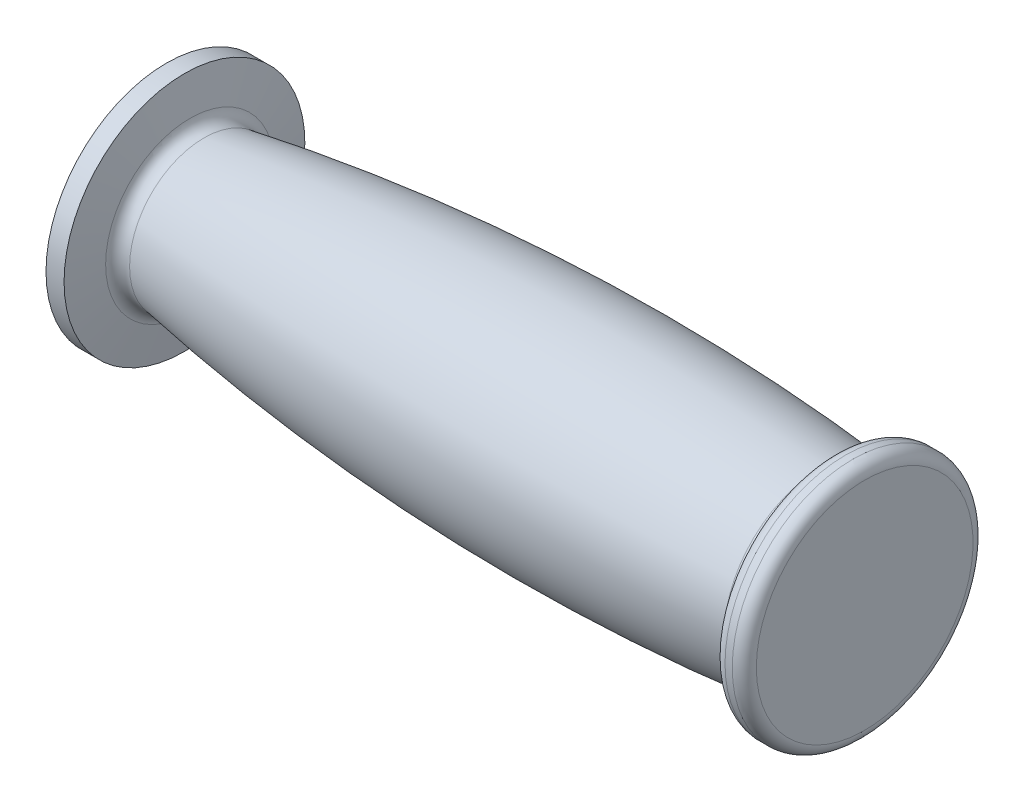
ISO-10303-21;
HEADER;
FILE_DESCRIPTION(('STEP AP214'),'2;1');
FILE_NAME('part.step','',(''),(''),'','','');
FILE_SCHEMA(('AUTOMOTIVE_DESIGN { 1 0 10303 214 1 1 1 1 }'));
ENDSEC;
DATA;
#1=APPLICATION_CONTEXT('core data for automotive mechanical design processes');
#2=APPLICATION_PROTOCOL_DEFINITION('international standard','automotive_design',2000,#1);
#3=PRODUCT_CONTEXT('',#1,'mechanical');
#4=PRODUCT('Part','Part','',(#3));
#5=PRODUCT_RELATED_PRODUCT_CATEGORY('part','',(#4));
#6=PRODUCT_DEFINITION_FORMATION('','',#4);
#7=PRODUCT_DEFINITION_CONTEXT('part definition',#1,'design');
#8=PRODUCT_DEFINITION('design','',#6,#7);
#9=PRODUCT_DEFINITION_SHAPE('','',#8);
#10=(LENGTH_UNIT() NAMED_UNIT(*) SI_UNIT(.MILLI.,.METRE.));
#11=(NAMED_UNIT(*) PLANE_ANGLE_UNIT() SI_UNIT($,.RADIAN.));
#12=(NAMED_UNIT(*) SI_UNIT($,.STERADIAN.) SOLID_ANGLE_UNIT());
#13=UNCERTAINTY_MEASURE_WITH_UNIT(LENGTH_MEASURE(1.E-05),#10,'distance_accuracy_value','');
#14=(GEOMETRIC_REPRESENTATION_CONTEXT(3) GLOBAL_UNCERTAINTY_ASSIGNED_CONTEXT((#13)) GLOBAL_UNIT_ASSIGNED_CONTEXT((#10,
#11,#12)) REPRESENTATION_CONTEXT('',''));
#15=CARTESIAN_POINT('',(0.,0.,0.));
#16=DIRECTION('',(0.,0.,1.));
#17=DIRECTION('',(1.,0.,0.));
#18=AXIS2_PLACEMENT_3D('',#15,#16,#17);
#19=CARTESIAN_POINT('',(0.,0.,0.));
#20=DIRECTION('',(1.,0.,0.));
#21=DIRECTION('',(0.,0.,-1.));
#22=AXIS2_PLACEMENT_3D('',#19,#20,#21);
#23=PLANE('',#22);
#24=CARTESIAN_POINT('',(0.,0.,0.));
#25=DIRECTION('',(-1.,0.,0.));
#26=DIRECTION('',(0.,0.,1.));
#27=AXIS2_PLACEMENT_3D('',#24,#25,#26);
#28=CIRCLE('',#27,5.00000000000017);
#29=CARTESIAN_POINT('',(0.,0.,5.00000000000017));
#30=VERTEX_POINT('',#29);
#31=EDGE_CURVE('E65',#30,#30,#28,.T.);
#32=ORIENTED_EDGE('',*,*,#31,.T.);
#33=EDGE_LOOP('',(#32));
#34=FACE_BOUND('',#33,.T.);
#35=ADVANCED_FACE('F33',(#34),#23,.F.);
#36=CARTESIAN_POINT('',(0.,0.,0.));
#37=DIRECTION('',(-1.,0.,0.));
#38=DIRECTION('',(0.,0.,1.));
#39=AXIS2_PLACEMENT_3D('',#36,#37,#38);
#40=CYLINDRICAL_SURFACE('',#39,5.00000000000009);
#41=ORIENTED_EDGE('',*,*,#31,.F.);
#42=EDGE_LOOP('',(#41));
#43=FACE_BOUND('',#42,.T.);
#44=CARTESIAN_POINT('',(5.,0.,0.));
#45=DIRECTION('',(-1.,0.,0.));
#46=DIRECTION('',(0.,0.,1.));
#47=AXIS2_PLACEMENT_3D('',#44,#45,#46);
#48=CIRCLE('',#47,5.);
#49=CARTESIAN_POINT('',(5.,0.,5.));
#50=VERTEX_POINT('',#49);
#51=EDGE_CURVE('E68',#50,#50,#48,.T.);
#52=ORIENTED_EDGE('',*,*,#51,.T.);
#53=EDGE_LOOP('',(#52));
#54=FACE_BOUND('',#53,.T.);
#55=ADVANCED_FACE('F102',(#43,#54),#40,.T.);
#56=CARTESIAN_POINT('',(5.,5.,0.));
#57=DIRECTION('',(1.,0.,0.));
#58=DIRECTION('',(0.,0.,-1.));
#59=AXIS2_PLACEMENT_3D('',#56,#57,#58);
#60=PLANE('',#59);
#61=ORIENTED_EDGE('',*,*,#51,.F.);
#62=EDGE_LOOP('',(#61));
#63=FACE_BOUND('',#62,.T.);
#64=CARTESIAN_POINT('',(5.,0.,0.));
#65=DIRECTION('',(-1.,0.,0.));
#66=DIRECTION('',(0.,0.,1.));
#67=AXIS2_PLACEMENT_3D('',#64,#65,#66);
#68=CIRCLE('',#67,7.);
#69=CARTESIAN_POINT('',(5.,0.,7.));
#70=VERTEX_POINT('',#69);
#71=EDGE_CURVE('E71',#70,#70,#68,.T.);
#72=ORIENTED_EDGE('',*,*,#71,.T.);
#73=EDGE_LOOP('',(#72));
#74=FACE_BOUND('',#73,.T.);
#75=ADVANCED_FACE('F108',(#63,#74),#60,.F.);
#76=CARTESIAN_POINT('',(0.,0.,0.));
#77=DIRECTION('',(-1.,0.,0.));
#78=DIRECTION('',(0.,0.,1.));
#79=AXIS2_PLACEMENT_3D('',#76,#77,#78);
#80=CYLINDRICAL_SURFACE('',#79,7.);
#81=ORIENTED_EDGE('',*,*,#71,.F.);
#82=EDGE_LOOP('',(#81));
#83=FACE_BOUND('',#82,.T.);
#84=CARTESIAN_POINT('',(7.,0.,0.));
#85=DIRECTION('',(-1.,0.,0.));
#86=DIRECTION('',(0.,0.,1.));
#87=AXIS2_PLACEMENT_3D('',#84,#85,#86);
#88=CIRCLE('',#87,7.);
#89=CARTESIAN_POINT('',(7.,0.,7.));
#90=VERTEX_POINT('',#89);
#91=EDGE_CURVE('E74',#90,#90,#88,.T.);
#92=ORIENTED_EDGE('',*,*,#91,.T.);
#93=EDGE_LOOP('',(#92));
#94=FACE_BOUND('',#93,.T.);
#95=ADVANCED_FACE('F188',(#83,#94),#80,.T.);
#96=CARTESIAN_POINT('',(8.99999999999999,0.,0.));
#97=DIRECTION('',(1.,0.,0.));
#98=DIRECTION('',(0.,0.,-1.));
#99=AXIS2_PLACEMENT_3D('',#96,#97,#98);
#100=CONICAL_SURFACE('',#99,20.0000000000002,1.41814699839963);
#101=ORIENTED_EDGE('',*,*,#91,.F.);
#102=EDGE_LOOP('',(#101));
#103=FACE_BOUND('',#102,.T.);
#104=CARTESIAN_POINT('',(8.99999999999999,0.,0.));
#105=DIRECTION('',(-1.,0.,0.));
#106=DIRECTION('',(0.,0.,1.));
#107=AXIS2_PLACEMENT_3D('',#104,#105,#106);
#108=CIRCLE('',#107,20.0000000000002);
#109=CARTESIAN_POINT('',(8.99999999999999,0.,20.0000000000002));
#110=VERTEX_POINT('',#109);
#111=EDGE_CURVE('E77',#110,#110,#108,.T.);
#112=ORIENTED_EDGE('',*,*,#111,.T.);
#113=EDGE_LOOP('',(#112));
#114=FACE_BOUND('',#113,.T.);
#115=ADVANCED_FACE('F98',(#103,#114),#100,.T.);
#116=CARTESIAN_POINT('',(0.,0.,0.));
#117=DIRECTION('',(-1.,0.,0.));
#118=DIRECTION('',(0.,0.,1.));
#119=AXIS2_PLACEMENT_3D('',#116,#117,#118);
#120=CYLINDRICAL_SURFACE('',#119,20.0000000000002);
#121=ORIENTED_EDGE('',*,*,#111,.F.);
#122=EDGE_LOOP('',(#121));
#123=FACE_BOUND('',#122,.T.);
#124=CARTESIAN_POINT('',(12.,0.,0.));
#125=DIRECTION('',(-1.,0.,0.));
#126=DIRECTION('',(0.,0.,1.));
#127=AXIS2_PLACEMENT_3D('',#124,#125,#126);
#128=CIRCLE('',#127,20.0000000000002);
#129=CARTESIAN_POINT('',(12.,0.,20.0000000000002));
#130=VERTEX_POINT('',#129);
#131=EDGE_CURVE('E80',#130,#130,#128,.T.);
#132=ORIENTED_EDGE('',*,*,#131,.T.);
#133=EDGE_LOOP('',(#132));
#134=FACE_BOUND('',#133,.T.);
#135=ADVANCED_FACE('F84',(#123,#134),#120,.T.);
#136=CARTESIAN_POINT('',(13.2307692307693,0.,0.));
#137=DIRECTION('',(-1.,0.,0.));
#138=DIRECTION('',(0.,0.,1.));
#139=AXIS2_PLACEMENT_3D('',#136,#137,#138);
#140=CONICAL_SURFACE('',#139,12.,1.41814699839962);
#141=CARTESIAN_POINT('',(12.9207529298606,0.,0.));
#142=DIRECTION('',(-1.,0.,0.));
#143=DIRECTION('',(0.,0.,1.));
#144=AXIS2_PLACEMENT_3D('',#141,#142,#143);
#145=CIRCLE('',#144,14.0151059559066);
#146=CARTESIAN_POINT('',(12.9207529298606,0.,14.0151059559066));
#147=VERTEX_POINT('',#146);
#148=EDGE_CURVE('E62',#147,#147,#145,.T.);
#149=ORIENTED_EDGE('',*,*,#148,.T.);
#150=EDGE_LOOP('',(#149));
#151=FACE_BOUND('',#150,.T.);
#152=ORIENTED_EDGE('',*,*,#131,.F.);
#153=EDGE_LOOP('',(#152));
#154=FACE_BOUND('',#153,.T.);
#155=ADVANCED_FACE('F86',(#151,#154),#140,.T.);
#156=CARTESIAN_POINT('',(79.5987957119094,0.,0.));
#157=DIRECTION('',(-1.,0.,0.));
#158=DIRECTION('',(0.,0.,1.));
#159=AXIS2_PLACEMENT_3D('',#156,#157,#158);
#160=DEGENERATE_TOROIDAL_SURFACE('',#159,364.391781986394,382.198231924082,.F.);
#161=CARTESIAN_POINT('',(15.2343083873242,0.,0.));
#162=DIRECTION('',(1.,0.,0.));
#163=DIRECTION('',(0.,0.,-1.));
#164=AXIS2_PLACEMENT_3D('',#161,#162,#163);
#165=CIRCLE('',#164,12.3477848994559);
#166=CARTESIAN_POINT('',(15.2343083873242,0.,-12.3477848994559));
#167=VERTEX_POINT('',#166);
#168=EDGE_CURVE('E56',#167,#167,#165,.T.);
#169=ORIENTED_EDGE('',*,*,#168,.T.);
#170=EDGE_LOOP('',(#169));
#171=FACE_BOUND('',#170,.T.);
#172=CARTESIAN_POINT('',(117.570158716464,0.,0.));
#173=DIRECTION('',(-1.,0.,0.));
#174=DIRECTION('',(0.,0.,1.));
#175=AXIS2_PLACEMENT_3D('',#172,#173,#174);
#176=CIRCLE('',#175,15.9155464697781);
#177=CARTESIAN_POINT('',(117.570158716464,0.,15.9155464697781));
#178=VERTEX_POINT('',#177);
#179=EDGE_CURVE('E59',#178,#178,#176,.T.);
#180=ORIENTED_EDGE('',*,*,#179,.T.);
#181=EDGE_LOOP('',(#180));
#182=FACE_BOUND('',#181,.T.);
#183=ADVANCED_FACE('F88',(#171,#182),#160,.F.);
#184=CARTESIAN_POINT('',(120.,0.,0.));
#185=DIRECTION('',(1.,0.,0.));
#186=DIRECTION('',(0.,0.,-1.));
#187=AXIS2_PLACEMENT_3D('',#184,#185,#186);
#188=CONICAL_SURFACE('',#187,20.,1.46607657167523);
#189=CARTESIAN_POINT('',(119.811764297859,0.,0.));
#190=DIRECTION('',(-1.,0.,0.));
#191=DIRECTION('',(0.,0.,1.));
#192=AXIS2_PLACEMENT_3D('',#189,#190,#191);
#193=CIRCLE('',#192,18.2090569265353);
#194=CARTESIAN_POINT('',(119.811764297859,0.,18.2090569265353));
#195=VERTEX_POINT('',#194);
#196=EDGE_CURVE('E10',#195,#195,#193,.T.);
#197=ORIENTED_EDGE('',*,*,#196,.T.);
#198=EDGE_LOOP('',(#197));
#199=FACE_BOUND('',#198,.T.);
#200=CARTESIAN_POINT('',(119.757902343217,0.,0.));
#201=DIRECTION('',(1.,0.,0.));
#202=DIRECTION('',(0.,0.,-1.));
#203=AXIS2_PLACEMENT_3D('',#200,#201,#202);
#204=CIRCLE('',#203,17.6965946598552);
#205=CARTESIAN_POINT('',(119.757902343217,0.,-17.6965946598552));
#206=VERTEX_POINT('',#205);
#207=EDGE_CURVE('E40',#206,#206,#204,.T.);
#208=ORIENTED_EDGE('',*,*,#207,.T.);
#209=EDGE_LOOP('',(#208));
#210=FACE_BOUND('',#209,.T.);
#211=ADVANCED_FACE('F95',(#199,#210),#188,.T.);
#212=CARTESIAN_POINT('',(0.,0.,0.));
#213=DIRECTION('',(-1.,0.,0.));
#214=DIRECTION('',(0.,0.,1.));
#215=AXIS2_PLACEMENT_3D('',#212,#213,#214);
#216=CYLINDRICAL_SURFACE('',#215,20.);
#217=CARTESIAN_POINT('',(123.,0.,0.));
#218=DIRECTION('',(-1.,0.,0.));
#219=DIRECTION('',(0.,0.,1.));
#220=AXIS2_PLACEMENT_3D('',#217,#218,#219);
#221=CIRCLE('',#220,20.);
#222=CARTESIAN_POINT('',(123.,0.,20.));
#223=VERTEX_POINT('',#222);
#224=EDGE_CURVE('E48',#223,#223,#221,.T.);
#225=ORIENTED_EDGE('',*,*,#224,.T.);
#226=EDGE_LOOP('',(#225));
#227=FACE_BOUND('',#226,.T.);
#228=CARTESIAN_POINT('',(121.800808088596,0.,0.));
#229=DIRECTION('',(1.,0.,0.));
#230=DIRECTION('',(0.,0.,-1.));
#231=AXIS2_PLACEMENT_3D('',#228,#229,#230);
#232=CIRCLE('',#231,20.);
#233=CARTESIAN_POINT('',(121.800808088596,0.,-20.));
#234=VERTEX_POINT('',#233);
#235=EDGE_CURVE('E53',#234,#234,#232,.T.);
#236=ORIENTED_EDGE('',*,*,#235,.T.);
#237=EDGE_LOOP('',(#236));
#238=FACE_BOUND('',#237,.T.);
#239=ADVANCED_FACE('F131',(#227,#238),#216,.T.);
#240=CARTESIAN_POINT('',(125.,20.,0.));
#241=DIRECTION('',(-1.,0.,0.));
#242=DIRECTION('',(0.,0.,1.));
#243=AXIS2_PLACEMENT_3D('',#240,#241,#242);
#244=PLANE('',#243);
#245=CARTESIAN_POINT('',(125.,0.,0.));
#246=DIRECTION('',(-1.,0.,0.));
#247=DIRECTION('',(0.,0.,1.));
#248=AXIS2_PLACEMENT_3D('',#245,#246,#247);
#249=CIRCLE('',#248,18.);
#250=CARTESIAN_POINT('',(125.,0.,18.));
#251=VERTEX_POINT('',#250);
#252=EDGE_CURVE('E44',#251,#251,#249,.F.);
#253=ORIENTED_EDGE('',*,*,#252,.T.);
#254=EDGE_LOOP('',(#253));
#255=FACE_BOUND('',#254,.T.);
#256=ADVANCED_FACE('F117',(#255),#244,.F.);
#257=CARTESIAN_POINT('',(14.8974963251619,0.,0.));
#258=DIRECTION('',(-1.,0.,0.));
#259=DIRECTION('',(0.,0.,1.));
#260=AXIS2_PLACEMENT_3D('',#257,#258,#259);
#261=TOROIDAL_SURFACE('',#260,14.3192203244145,2.);
#262=ORIENTED_EDGE('',*,*,#168,.F.);
#263=EDGE_LOOP('',(#262));
#264=FACE_BOUND('',#263,.T.);
#265=ORIENTED_EDGE('',*,*,#148,.F.);
#266=EDGE_LOOP('',(#265));
#267=FACE_BOUND('',#266,.T.);
#268=ADVANCED_FACE('F113',(#264,#267),#261,.F.);
#269=CARTESIAN_POINT('',(123.,0.,0.));
#270=DIRECTION('',(-1.,0.,0.));
#271=DIRECTION('',(0.,0.,1.));
#272=AXIS2_PLACEMENT_3D('',#269,#270,#271);
#273=TOROIDAL_SURFACE('',#272,18.,2.);
#274=ORIENTED_EDGE('',*,*,#252,.F.);
#275=EDGE_LOOP('',(#274));
#276=FACE_BOUND('',#275,.T.);
#277=ORIENTED_EDGE('',*,*,#224,.F.);
#278=EDGE_LOOP('',(#277));
#279=FACE_BOUND('',#278,.T.);
#280=ADVANCED_FACE('F116',(#276,#279),#273,.T.);
#281=CARTESIAN_POINT('',(121.800808088596,0.,0.));
#282=DIRECTION('',(1.,0.,0.));
#283=DIRECTION('',(0.,0.,-1.));
#284=AXIS2_PLACEMENT_3D('',#281,#282,#283);
#285=TOROIDAL_SURFACE('',#284,18.,2.);
#286=ORIENTED_EDGE('',*,*,#235,.F.);
#287=EDGE_LOOP('',(#286));
#288=FACE_BOUND('',#287,.T.);
#289=ORIENTED_EDGE('',*,*,#196,.F.);
#290=EDGE_LOOP('',(#289));
#291=FACE_BOUND('',#290,.T.);
#292=ADVANCED_FACE('F120',(#288,#291),#285,.T.);
#293=CARTESIAN_POINT('',(117.768858552481,0.,0.));
#294=DIRECTION('',(-1.,0.,0.));
#295=DIRECTION('',(0.,0.,1.));
#296=AXIS2_PLACEMENT_3D('',#293,#294,#295);
#297=TOROIDAL_SURFACE('',#296,17.9056515863905,2.);
#298=ORIENTED_EDGE('',*,*,#207,.F.);
#299=EDGE_LOOP('',(#298));
#300=FACE_BOUND('',#299,.T.);
#301=ORIENTED_EDGE('',*,*,#179,.F.);
#302=EDGE_LOOP('',(#301));
#303=FACE_BOUND('',#302,.T.);
#304=ADVANCED_FACE('F35',(#300,#303),#297,.F.);
#305=CLOSED_SHELL('',(#35,#55,#75,#95,#115,#135,#155,#183,#211,#239,#256,#268,#280,#292,#304));
#306=MANIFOLD_SOLID_BREP('B2',#305);
#307=ADVANCED_BREP_SHAPE_REPRESENTATION('',(#18,#306),#14);
#308=SHAPE_DEFINITION_REPRESENTATION(#9,#307);
ENDSEC;
END-ISO-10303-21;
